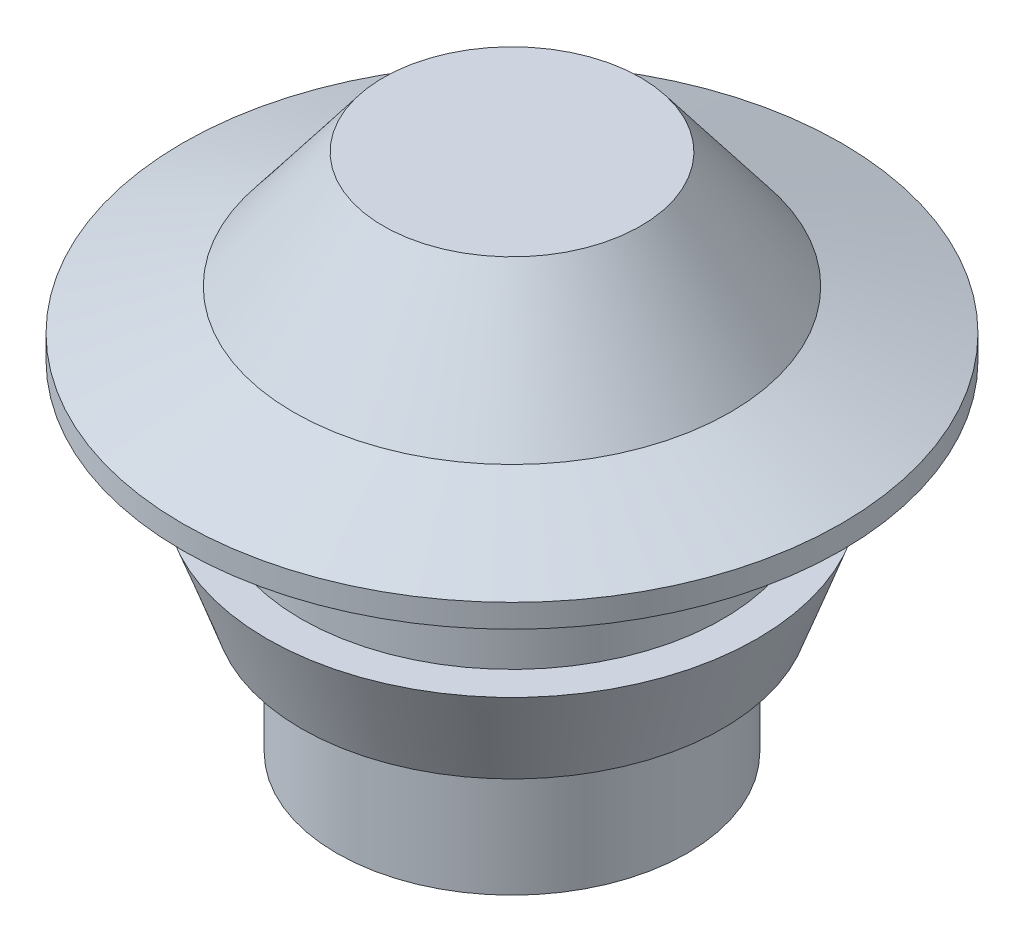
ISO-10303-21;
HEADER;
FILE_DESCRIPTION(('STEP AP214'),'2;1');
FILE_NAME('part.step','',(''),(''),'','','');
FILE_SCHEMA(('AUTOMOTIVE_DESIGN { 1 0 10303 214 1 1 1 1 }'));
ENDSEC;
DATA;
#1=APPLICATION_CONTEXT('core data for automotive mechanical design processes');
#2=APPLICATION_PROTOCOL_DEFINITION('international standard','automotive_design',2000,#1);
#3=PRODUCT_CONTEXT('',#1,'mechanical');
#4=PRODUCT('Part','Part','',(#3));
#5=PRODUCT_RELATED_PRODUCT_CATEGORY('part','',(#4));
#6=PRODUCT_DEFINITION_FORMATION('','',#4);
#7=PRODUCT_DEFINITION_CONTEXT('part definition',#1,'design');
#8=PRODUCT_DEFINITION('design','',#6,#7);
#9=PRODUCT_DEFINITION_SHAPE('','',#8);
#10=(LENGTH_UNIT() NAMED_UNIT(*) SI_UNIT(.MILLI.,.METRE.));
#11=(NAMED_UNIT(*) PLANE_ANGLE_UNIT() SI_UNIT($,.RADIAN.));
#12=(NAMED_UNIT(*) SI_UNIT($,.STERADIAN.) SOLID_ANGLE_UNIT());
#13=UNCERTAINTY_MEASURE_WITH_UNIT(LENGTH_MEASURE(1.E-05),#10,'distance_accuracy_value','');
#14=(GEOMETRIC_REPRESENTATION_CONTEXT(3) GLOBAL_UNCERTAINTY_ASSIGNED_CONTEXT((#13)) GLOBAL_UNIT_ASSIGNED_CONTEXT((#10,
#11,#12)) REPRESENTATION_CONTEXT('',''));
#15=CARTESIAN_POINT('',(0.,0.,0.));
#16=DIRECTION('',(0.,0.,1.));
#17=DIRECTION('',(1.,0.,0.));
#18=AXIS2_PLACEMENT_3D('',#15,#16,#17);
#19=CARTESIAN_POINT('',(0.,22.325,0.));
#20=DIRECTION('',(0.,-1.,0.));
#21=DIRECTION('',(0.,0.,-1.));
#22=AXIS2_PLACEMENT_3D('',#19,#20,#21);
#23=PLANE('',#22);
#24=CARTESIAN_POINT('',(0.,22.325,0.));
#25=DIRECTION('',(0.,-1.,0.));
#26=DIRECTION('',(0.,0.,-1.));
#27=AXIS2_PLACEMENT_3D('',#24,#25,#26);
#28=CIRCLE('',#27,5.525);
#29=CARTESIAN_POINT('',(0.,22.325,-5.525));
#30=VERTEX_POINT('',#29);
#31=EDGE_CURVE('E10',#30,#30,#28,.T.);
#32=ORIENTED_EDGE('',*,*,#31,.F.);
#33=EDGE_LOOP('',(#32));
#34=FACE_BOUND('',#33,.T.);
#35=ADVANCED_FACE('F45',(#34),#23,.F.);
#36=CARTESIAN_POINT('',(0.,22.325,0.));
#37=DIRECTION('',(0.,-1.,0.));
#38=DIRECTION('',(0.,0.,-1.));
#39=AXIS2_PLACEMENT_3D('',#36,#37,#38);
#40=CONICAL_SURFACE('',#39,5.525,0.656178717991395);
#41=CARTESIAN_POINT('',(0.,17.325,0.));
#42=DIRECTION('',(0.,-1.,0.));
#43=DIRECTION('',(0.,0.,-1.));
#44=AXIS2_PLACEMENT_3D('',#41,#42,#43);
#45=CIRCLE('',#44,9.375);
#46=CARTESIAN_POINT('',(0.,17.325,-9.375));
#47=VERTEX_POINT('',#46);
#48=EDGE_CURVE('E52',#47,#47,#45,.T.);
#49=ORIENTED_EDGE('',*,*,#48,.F.);
#50=EDGE_LOOP('',(#49));
#51=FACE_BOUND('',#50,.T.);
#52=ORIENTED_EDGE('',*,*,#31,.T.);
#53=EDGE_LOOP('',(#52));
#54=FACE_BOUND('',#53,.T.);
#55=ADVANCED_FACE('F142',(#51,#54),#40,.T.);
#56=CARTESIAN_POINT('',(0.,17.325,0.));
#57=DIRECTION('',(0.,-1.,0.));
#58=DIRECTION('',(0.,0.,-1.));
#59=AXIS2_PLACEMENT_3D('',#56,#57,#58);
#60=CONICAL_SURFACE('',#59,9.375,1.21950537894398);
#61=CARTESIAN_POINT('',(0.,15.575,0.));
#62=DIRECTION('',(0.,-1.,0.));
#63=DIRECTION('',(0.,0.,-1.));
#64=AXIS2_PLACEMENT_3D('',#61,#62,#63);
#65=CIRCLE('',#64,14.15);
#66=CARTESIAN_POINT('',(0.,15.575,-14.15));
#67=VERTEX_POINT('',#66);
#68=EDGE_CURVE('E56',#67,#67,#65,.T.);
#69=ORIENTED_EDGE('',*,*,#68,.F.);
#70=EDGE_LOOP('',(#69));
#71=FACE_BOUND('',#70,.T.);
#72=ORIENTED_EDGE('',*,*,#48,.T.);
#73=EDGE_LOOP('',(#72));
#74=FACE_BOUND('',#73,.T.);
#75=ADVANCED_FACE('F136',(#71,#74),#60,.T.);
#76=CARTESIAN_POINT('',(0.,0.,0.));
#77=DIRECTION('',(0.,-1.,0.));
#78=DIRECTION('',(0.,0.,-1.));
#79=AXIS2_PLACEMENT_3D('',#76,#77,#78);
#80=CYLINDRICAL_SURFACE('',#79,14.15);
#81=CARTESIAN_POINT('',(0.,14.575,0.));
#82=DIRECTION('',(0.,-1.,0.));
#83=DIRECTION('',(0.,0.,-1.));
#84=AXIS2_PLACEMENT_3D('',#81,#82,#83);
#85=CIRCLE('',#84,14.15);
#86=CARTESIAN_POINT('',(0.,14.575,-14.15));
#87=VERTEX_POINT('',#86);
#88=EDGE_CURVE('E61',#87,#87,#85,.T.);
#89=ORIENTED_EDGE('',*,*,#88,.F.);
#90=EDGE_LOOP('',(#89));
#91=FACE_BOUND('',#90,.T.);
#92=ORIENTED_EDGE('',*,*,#68,.T.);
#93=EDGE_LOOP('',(#92));
#94=FACE_BOUND('',#93,.T.);
#95=ADVANCED_FACE('F130',(#91,#94),#80,.T.);
#96=CARTESIAN_POINT('',(-9.05,14.575,0.));
#97=DIRECTION('',(0.,1.,0.));
#98=DIRECTION('',(0.,0.,1.));
#99=AXIS2_PLACEMENT_3D('',#96,#97,#98);
#100=PLANE('',#99);
#101=CARTESIAN_POINT('',(0.,14.575,0.));
#102=DIRECTION('',(0.,-1.,0.));
#103=DIRECTION('',(0.,0.,-1.));
#104=AXIS2_PLACEMENT_3D('',#101,#102,#103);
#105=CIRCLE('',#104,9.05);
#106=CARTESIAN_POINT('',(0.,14.575,-9.05));
#107=VERTEX_POINT('',#106);
#108=EDGE_CURVE('E64',#107,#107,#105,.T.);
#109=ORIENTED_EDGE('',*,*,#108,.F.);
#110=EDGE_LOOP('',(#109));
#111=FACE_BOUND('',#110,.T.);
#112=ORIENTED_EDGE('',*,*,#88,.T.);
#113=EDGE_LOOP('',(#112));
#114=FACE_BOUND('',#113,.T.);
#115=ADVANCED_FACE('F124',(#111,#114),#100,.F.);
#116=CARTESIAN_POINT('',(0.,0.,0.));
#117=DIRECTION('',(0.,-1.,0.));
#118=DIRECTION('',(0.,0.,-1.));
#119=AXIS2_PLACEMENT_3D('',#116,#117,#118);
#120=CYLINDRICAL_SURFACE('',#119,9.05);
#121=CARTESIAN_POINT('',(0.,9.475,0.));
#122=DIRECTION('',(0.,-1.,0.));
#123=DIRECTION('',(0.,0.,-1.));
#124=AXIS2_PLACEMENT_3D('',#121,#122,#123);
#125=CIRCLE('',#124,9.05);
#126=CARTESIAN_POINT('',(0.,9.475,-9.05));
#127=VERTEX_POINT('',#126);
#128=EDGE_CURVE('E67',#127,#127,#125,.T.);
#129=ORIENTED_EDGE('',*,*,#128,.F.);
#130=EDGE_LOOP('',(#129));
#131=FACE_BOUND('',#130,.T.);
#132=ORIENTED_EDGE('',*,*,#108,.T.);
#133=EDGE_LOOP('',(#132));
#134=FACE_BOUND('',#133,.T.);
#135=ADVANCED_FACE('F118',(#131,#134),#120,.T.);
#136=CARTESIAN_POINT('',(-9.05,9.475,0.));
#137=DIRECTION('',(0.,-1.,0.));
#138=DIRECTION('',(0.,0.,-1.));
#139=AXIS2_PLACEMENT_3D('',#136,#137,#138);
#140=PLANE('',#139);
#141=CARTESIAN_POINT('',(0.,9.475,0.));
#142=DIRECTION('',(0.,-1.,0.));
#143=DIRECTION('',(0.,0.,-1.));
#144=AXIS2_PLACEMENT_3D('',#141,#142,#143);
#145=CIRCLE('',#144,10.525);
#146=CARTESIAN_POINT('',(0.,9.475,-10.525));
#147=VERTEX_POINT('',#146);
#148=EDGE_CURVE('E70',#147,#147,#145,.T.);
#149=ORIENTED_EDGE('',*,*,#148,.F.);
#150=EDGE_LOOP('',(#149));
#151=FACE_BOUND('',#150,.T.);
#152=ORIENTED_EDGE('',*,*,#128,.T.);
#153=EDGE_LOOP('',(#152));
#154=FACE_BOUND('',#153,.T.);
#155=ADVANCED_FACE('F112',(#151,#154),#140,.F.);
#156=CARTESIAN_POINT('',(0.,9.475,0.));
#157=DIRECTION('',(0.,1.,0.));
#158=DIRECTION('',(0.,0.,1.));
#159=AXIS2_PLACEMENT_3D('',#156,#157,#158);
#160=CONICAL_SURFACE('',#159,10.525,0.347292443793931);
#161=CARTESIAN_POINT('',(0.,5.4,0.));
#162=DIRECTION('',(0.,-1.,0.));
#163=DIRECTION('',(0.,0.,-1.));
#164=AXIS2_PLACEMENT_3D('',#161,#162,#163);
#165=CIRCLE('',#164,9.05);
#166=CARTESIAN_POINT('',(0.,5.4,-9.05));
#167=VERTEX_POINT('',#166);
#168=EDGE_CURVE('E73',#167,#167,#165,.T.);
#169=ORIENTED_EDGE('',*,*,#168,.F.);
#170=EDGE_LOOP('',(#169));
#171=FACE_BOUND('',#170,.T.);
#172=ORIENTED_EDGE('',*,*,#148,.T.);
#173=EDGE_LOOP('',(#172));
#174=FACE_BOUND('',#173,.T.);
#175=ADVANCED_FACE('F106',(#171,#174),#160,.T.);
#176=CARTESIAN_POINT('',(-7.525,5.4,0.));
#177=DIRECTION('',(0.,1.,0.));
#178=DIRECTION('',(0.,0.,1.));
#179=AXIS2_PLACEMENT_3D('',#176,#177,#178);
#180=PLANE('',#179);
#181=CARTESIAN_POINT('',(0.,5.4,0.));
#182=DIRECTION('',(0.,-1.,0.));
#183=DIRECTION('',(0.,0.,-1.));
#184=AXIS2_PLACEMENT_3D('',#181,#182,#183);
#185=CIRCLE('',#184,7.525);
#186=CARTESIAN_POINT('',(0.,5.4,-7.525));
#187=VERTEX_POINT('',#186);
#188=EDGE_CURVE('E76',#187,#187,#185,.T.);
#189=ORIENTED_EDGE('',*,*,#188,.F.);
#190=EDGE_LOOP('',(#189));
#191=FACE_BOUND('',#190,.T.);
#192=ORIENTED_EDGE('',*,*,#168,.T.);
#193=EDGE_LOOP('',(#192));
#194=FACE_BOUND('',#193,.T.);
#195=ADVANCED_FACE('F100',(#191,#194),#180,.F.);
#196=CARTESIAN_POINT('',(0.,0.,0.));
#197=DIRECTION('',(0.,-1.,0.));
#198=DIRECTION('',(0.,0.,-1.));
#199=AXIS2_PLACEMENT_3D('',#196,#197,#198);
#200=CYLINDRICAL_SURFACE('',#199,7.525);
#201=CARTESIAN_POINT('',(0.,0.,0.));
#202=DIRECTION('',(0.,-1.,0.));
#203=DIRECTION('',(0.,0.,-1.));
#204=AXIS2_PLACEMENT_3D('',#201,#202,#203);
#205=CIRCLE('',#204,7.525);
#206=CARTESIAN_POINT('',(0.,0.,-7.525));
#207=VERTEX_POINT('',#206);
#208=EDGE_CURVE('E79',#207,#207,#205,.T.);
#209=ORIENTED_EDGE('',*,*,#208,.F.);
#210=EDGE_LOOP('',(#209));
#211=FACE_BOUND('',#210,.T.);
#212=ORIENTED_EDGE('',*,*,#188,.T.);
#213=EDGE_LOOP('',(#212));
#214=FACE_BOUND('',#213,.T.);
#215=ADVANCED_FACE('F94',(#211,#214),#200,.T.);
#216=CARTESIAN_POINT('',(0.,0.,0.));
#217=DIRECTION('',(0.,1.,0.));
#218=DIRECTION('',(0.,0.,1.));
#219=AXIS2_PLACEMENT_3D('',#216,#217,#218);
#220=PLANE('',#219);
#221=CARTESIAN_POINT('',(0.,0.,0.));
#222=DIRECTION('',(0.,1.,0.));
#223=DIRECTION('',(0.,0.,1.));
#224=AXIS2_PLACEMENT_3D('',#221,#222,#223);
#225=CIRCLE('',#224,5.6);
#226=CARTESIAN_POINT('',(0.,0.,5.6));
#227=VERTEX_POINT('',#226);
#228=EDGE_CURVE('E48',#227,#227,#225,.F.);
#229=ORIENTED_EDGE('',*,*,#228,.F.);
#230=EDGE_LOOP('',(#229));
#231=FACE_BOUND('',#230,.T.);
#232=ORIENTED_EDGE('',*,*,#208,.T.);
#233=EDGE_LOOP('',(#232));
#234=FACE_BOUND('',#233,.T.);
#235=ADVANCED_FACE('F91',(#231,#234),#220,.F.);
#236=CARTESIAN_POINT('',(0.,-1.2E-05,0.));
#237=DIRECTION('',(0.,1.,0.));
#238=DIRECTION('',(0.,0.,1.));
#239=AXIS2_PLACEMENT_3D('',#236,#237,#238);
#240=CYLINDRICAL_SURFACE('',#239,5.6);
#241=CARTESIAN_POINT('',(0.,9.075,0.));
#242=DIRECTION('',(0.,-1.,0.));
#243=DIRECTION('',(0.,0.,-1.));
#244=AXIS2_PLACEMENT_3D('',#241,#242,#243);
#245=CIRCLE('',#244,5.6);
#246=CARTESIAN_POINT('',(0.,9.075,5.6));
#247=VERTEX_POINT('',#246);
#248=EDGE_CURVE('E82',#247,#247,#245,.T.);
#249=CARTESIAN_POINT('',(0.,9.075,5.6));
#250=CARTESIAN_POINT('',(0.,8.98046875,5.6));
#251=CARTESIAN_POINT('',(0.,8.8859375,5.6));
#252=CARTESIAN_POINT('',(0.,8.696875,5.6));
#253=CARTESIAN_POINT('',(0.,8.60234375,5.6));
#254=CARTESIAN_POINT('',(0.,8.41328125,5.6));
#255=CARTESIAN_POINT('',(0.,8.31875,5.6));
#256=CARTESIAN_POINT('',(0.,8.1296875,5.6));
#257=CARTESIAN_POINT('',(0.,8.03515625,5.6));
#258=CARTESIAN_POINT('',(0.,7.84609375,5.6));
#259=CARTESIAN_POINT('',(0.,7.7515625,5.6));
#260=CARTESIAN_POINT('',(0.,7.5625,5.6));
#261=CARTESIAN_POINT('',(0.,7.46796875,5.6));
#262=CARTESIAN_POINT('',(0.,7.27890625,5.6));
#263=CARTESIAN_POINT('',(0.,7.184375,5.6));
#264=CARTESIAN_POINT('',(0.,6.9953125,5.6));
#265=CARTESIAN_POINT('',(0.,6.90078125,5.6));
#266=CARTESIAN_POINT('',(0.,6.71171875,5.6));
#267=CARTESIAN_POINT('',(0.,6.6171875,5.6));
#268=CARTESIAN_POINT('',(0.,6.428125,5.6));
#269=CARTESIAN_POINT('',(0.,6.33359375,5.6));
#270=CARTESIAN_POINT('',(0.,6.14453125,5.6));
#271=CARTESIAN_POINT('',(0.,6.05,5.6));
#272=CARTESIAN_POINT('',(0.,5.8609375,5.6));
#273=CARTESIAN_POINT('',(0.,5.76640625,5.6));
#274=CARTESIAN_POINT('',(0.,5.57734375,5.6));
#275=CARTESIAN_POINT('',(0.,5.4828125,5.6));
#276=CARTESIAN_POINT('',(0.,5.29375,5.6));
#277=CARTESIAN_POINT('',(0.,5.19921875,5.6));
#278=CARTESIAN_POINT('',(0.,5.01015625,5.6));
#279=CARTESIAN_POINT('',(0.,4.915625,5.6));
#280=CARTESIAN_POINT('',(0.,4.7265625,5.6));
#281=CARTESIAN_POINT('',(0.,4.63203125,5.6));
#282=CARTESIAN_POINT('',(0.,4.44296875,5.6));
#283=CARTESIAN_POINT('',(0.,4.3484375,5.6));
#284=CARTESIAN_POINT('',(0.,4.159375,5.6));
#285=CARTESIAN_POINT('',(0.,4.06484375,5.6));
#286=CARTESIAN_POINT('',(0.,3.87578125,5.6));
#287=CARTESIAN_POINT('',(0.,3.78125,5.6));
#288=CARTESIAN_POINT('',(0.,3.5921875,5.6));
#289=CARTESIAN_POINT('',(0.,3.49765625,5.6));
#290=CARTESIAN_POINT('',(0.,3.30859375,5.6));
#291=CARTESIAN_POINT('',(0.,3.2140625,5.6));
#292=CARTESIAN_POINT('',(0.,3.025,5.6));
#293=CARTESIAN_POINT('',(0.,2.93046875,5.6));
#294=CARTESIAN_POINT('',(0.,2.74140625,5.6));
#295=CARTESIAN_POINT('',(0.,2.646875,5.6));
#296=CARTESIAN_POINT('',(0.,2.4578125,5.6));
#297=CARTESIAN_POINT('',(0.,2.36328125,5.6));
#298=CARTESIAN_POINT('',(0.,2.17421875,5.6));
#299=CARTESIAN_POINT('',(0.,2.0796875,5.6));
#300=CARTESIAN_POINT('',(0.,1.890625,5.6));
#301=CARTESIAN_POINT('',(0.,1.79609375,5.6));
#302=CARTESIAN_POINT('',(0.,1.60703125,5.6));
#303=CARTESIAN_POINT('',(0.,1.5125,5.6));
#304=CARTESIAN_POINT('',(0.,1.3234375,5.6));
#305=CARTESIAN_POINT('',(0.,1.22890625,5.6));
#306=CARTESIAN_POINT('',(0.,1.03984375,5.6));
#307=CARTESIAN_POINT('',(0.,0.945312499999999,5.6));
#308=CARTESIAN_POINT('',(0.,0.756249999999999,5.6));
#309=CARTESIAN_POINT('',(0.,0.661718749999999,5.6));
#310=CARTESIAN_POINT('',(0.,0.472656249999999,5.6));
#311=CARTESIAN_POINT('',(0.,0.378124999999999,5.6));
#312=CARTESIAN_POINT('',(0.,0.189062499999999,5.6));
#313=CARTESIAN_POINT('',(0.,0.0945312499999988,5.6));
#314=CARTESIAN_POINT('',(0.,0.,5.6));
#315=B_SPLINE_CURVE_WITH_KNOTS('',3,(#249,#250,#251,#252,#253,#254,#255,#256,#257,#258,#259,
#260,#261,#262,#263,#264,#265,#266,#267,#268,#269,#270,#271,#272,#273,#274,#275,#276,#277,#278,
#279,#280,#281,#282,#283,#284,#285,#286,#287,#288,#289,#290,#291,#292,#293,#294,#295,#296,#297,
#298,#299,#300,#301,#302,#303,#304,#305,#306,#307,#308,#309,#310,#311,#312,#313,#314),
.UNSPECIFIED.,.F.,.F.,(4,2,2,2,2,2,2,2,2,2,2,2,2,2,2,2,2,2,2,2,2,2,2,2,2,2,2,2,2,2,2,2,4),(0.,
0.28359375,0.5671875,0.85078125,1.134375,1.41796875,1.7015625,1.98515625,2.26875,2.55234375,
2.8359375,3.11953125,3.403125,3.68671875,3.9703125,4.25390625,4.5375,4.82109375,5.1046875,
5.38828125,5.671875,5.95546875,6.2390625,6.52265625,6.80625,7.08984375,7.3734375,7.65703125,
7.940625,8.22421875,8.5078125,8.79140625,9.075),.UNSPECIFIED.);
#316=EDGE_CURVE('BSEAM89',#247,#227,#315,.T.);
#317=ORIENTED_EDGE('',*,*,#248,.F.);
#318=ORIENTED_EDGE('',*,*,#228,.T.);
#319=ORIENTED_EDGE('',*,*,#316,.T.);
#320=ORIENTED_EDGE('',*,*,#316,.F.);
#321=EDGE_LOOP('',(#317,#319,#318,#320));
#322=FACE_BOUND('',#321,.T.);
#323=ADVANCED_FACE('F89',(#322),#240,.F.);
#324=CARTESIAN_POINT('',(0.,9.075,0.));
#325=DIRECTION('',(0.,-1.,0.));
#326=DIRECTION('',(0.,0.,-1.));
#327=AXIS2_PLACEMENT_3D('',#324,#325,#326);
#328=PLANE('',#327);
#329=ORIENTED_EDGE('',*,*,#248,.T.);
#330=EDGE_LOOP('',(#329));
#331=FACE_BOUND('',#330,.T.);
#332=ADVANCED_FACE('F154',(#331),#328,.T.);
#333=CLOSED_SHELL('',(#35,#55,#75,#95,#115,#135,#155,#175,#195,#215,#235,#323,#332));
#334=MANIFOLD_SOLID_BREP('B2',#333);
#335=ADVANCED_BREP_SHAPE_REPRESENTATION('',(#18,#334),#14);
#336=SHAPE_DEFINITION_REPRESENTATION(#9,#335);
ENDSEC;
END-ISO-10303-21;
